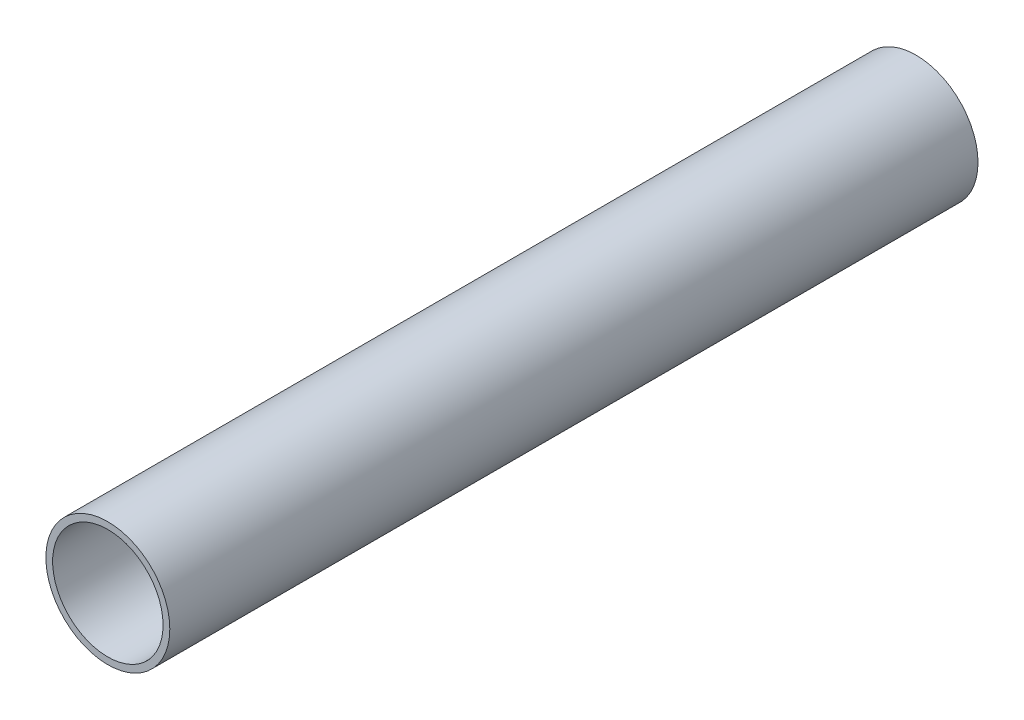
ISO-10303-21;
HEADER;
FILE_DESCRIPTION(('STEP AP214'),'2;1');
FILE_NAME('part.step','',(''),(''),'','','');
FILE_SCHEMA(('AUTOMOTIVE_DESIGN { 1 0 10303 214 1 1 1 1 }'));
ENDSEC;
DATA;
#1=APPLICATION_CONTEXT('core data for automotive mechanical design processes');
#2=APPLICATION_PROTOCOL_DEFINITION('international standard','automotive_design',2000,#1);
#3=PRODUCT_CONTEXT('',#1,'mechanical');
#4=PRODUCT('Part','Part','',(#3));
#5=PRODUCT_RELATED_PRODUCT_CATEGORY('part','',(#4));
#6=PRODUCT_DEFINITION_FORMATION('','',#4);
#7=PRODUCT_DEFINITION_CONTEXT('part definition',#1,'design');
#8=PRODUCT_DEFINITION('design','',#6,#7);
#9=PRODUCT_DEFINITION_SHAPE('','',#8);
#10=(LENGTH_UNIT() NAMED_UNIT(*) SI_UNIT(.MILLI.,.METRE.));
#11=(NAMED_UNIT(*) PLANE_ANGLE_UNIT() SI_UNIT($,.RADIAN.));
#12=(NAMED_UNIT(*) SI_UNIT($,.STERADIAN.) SOLID_ANGLE_UNIT());
#13=UNCERTAINTY_MEASURE_WITH_UNIT(LENGTH_MEASURE(1.E-05),#10,'distance_accuracy_value','');
#14=(GEOMETRIC_REPRESENTATION_CONTEXT(3) GLOBAL_UNCERTAINTY_ASSIGNED_CONTEXT((#13)) GLOBAL_UNIT_ASSIGNED_CONTEXT((#10,
#11,#12)) REPRESENTATION_CONTEXT('',''));
#15=CARTESIAN_POINT('',(0.,0.,0.));
#16=DIRECTION('',(0.,0.,1.));
#17=DIRECTION('',(1.,0.,0.));
#18=AXIS2_PLACEMENT_3D('',#15,#16,#17);
#19=CARTESIAN_POINT('',(0.,0.,30.));
#20=DIRECTION('',(0.,0.,-1.));
#21=DIRECTION('',(-1.,0.,0.));
#22=AXIS2_PLACEMENT_3D('',#19,#20,#21);
#23=CYLINDRICAL_SURFACE('',#22,2.05);
#24=CARTESIAN_POINT('',(0.,0.,30.));
#25=DIRECTION('',(0.,0.,1.));
#26=DIRECTION('',(1.,0.,0.));
#27=AXIS2_PLACEMENT_3D('',#24,#25,#26);
#28=CIRCLE('',#27,2.05);
#29=CARTESIAN_POINT('',(2.05,0.,30.));
#30=VERTEX_POINT('',#29);
#31=EDGE_CURVE('E40',#30,#30,#28,.T.);
#32=ORIENTED_EDGE('',*,*,#31,.T.);
#33=EDGE_LOOP('',(#32));
#34=FACE_BOUND('',#33,.T.);
#35=CARTESIAN_POINT('',(0.,0.,0.));
#36=DIRECTION('',(0.,0.,1.));
#37=DIRECTION('',(1.,0.,0.));
#38=AXIS2_PLACEMENT_3D('',#35,#36,#37);
#39=CIRCLE('',#38,2.05);
#40=CARTESIAN_POINT('',(2.05,0.,0.));
#41=VERTEX_POINT('',#40);
#42=EDGE_CURVE('E46',#41,#41,#39,.T.);
#43=ORIENTED_EDGE('',*,*,#42,.F.);
#44=EDGE_LOOP('',(#43));
#45=FACE_BOUND('',#44,.T.);
#46=ADVANCED_FACE('F33',(#34,#45),#23,.F.);
#47=CARTESIAN_POINT('',(0.,0.,30.));
#48=DIRECTION('',(0.,0.,-1.));
#49=DIRECTION('',(-1.,0.,0.));
#50=AXIS2_PLACEMENT_3D('',#47,#48,#49);
#51=CYLINDRICAL_SURFACE('',#50,2.3);
#52=CARTESIAN_POINT('',(0.,0.,30.));
#53=DIRECTION('',(0.,0.,1.));
#54=DIRECTION('',(1.,0.,0.));
#55=AXIS2_PLACEMENT_3D('',#52,#53,#54);
#56=CIRCLE('',#55,2.3);
#57=CARTESIAN_POINT('',(2.3,0.,30.));
#58=VERTEX_POINT('',#57);
#59=EDGE_CURVE('E10',#58,#58,#56,.T.);
#60=ORIENTED_EDGE('',*,*,#59,.F.);
#61=EDGE_LOOP('',(#60));
#62=FACE_BOUND('',#61,.T.);
#63=CARTESIAN_POINT('',(0.,0.,0.));
#64=DIRECTION('',(0.,0.,1.));
#65=DIRECTION('',(1.,0.,0.));
#66=AXIS2_PLACEMENT_3D('',#63,#64,#65);
#67=CIRCLE('',#66,2.3);
#68=CARTESIAN_POINT('',(2.3,0.,0.));
#69=VERTEX_POINT('',#68);
#70=EDGE_CURVE('E36',#69,#69,#67,.T.);
#71=ORIENTED_EDGE('',*,*,#70,.T.);
#72=EDGE_LOOP('',(#71));
#73=FACE_BOUND('',#72,.T.);
#74=ADVANCED_FACE('F53',(#62,#73),#51,.T.);
#75=CARTESIAN_POINT('',(0.,0.,30.));
#76=DIRECTION('',(0.,0.,1.));
#77=DIRECTION('',(1.,0.,0.));
#78=AXIS2_PLACEMENT_3D('',#75,#76,#77);
#79=PLANE('',#78);
#80=ORIENTED_EDGE('',*,*,#31,.F.);
#81=EDGE_LOOP('',(#80));
#82=FACE_BOUND('',#81,.T.);
#83=ORIENTED_EDGE('',*,*,#59,.T.);
#84=EDGE_LOOP('',(#83));
#85=FACE_BOUND('',#84,.T.);
#86=ADVANCED_FACE('F57',(#82,#85),#79,.T.);
#87=CARTESIAN_POINT('',(0.,0.,0.));
#88=DIRECTION('',(0.,0.,1.));
#89=DIRECTION('',(1.,0.,0.));
#90=AXIS2_PLACEMENT_3D('',#87,#88,#89);
#91=PLANE('',#90);
#92=ORIENTED_EDGE('',*,*,#42,.T.);
#93=EDGE_LOOP('',(#92));
#94=FACE_BOUND('',#93,.T.);
#95=ORIENTED_EDGE('',*,*,#70,.F.);
#96=EDGE_LOOP('',(#95));
#97=FACE_BOUND('',#96,.T.);
#98=ADVANCED_FACE('F55',(#94,#97),#91,.F.);
#99=CLOSED_SHELL('',(#46,#74,#86,#98));
#100=MANIFOLD_SOLID_BREP('B2',#99);
#101=ADVANCED_BREP_SHAPE_REPRESENTATION('',(#18,#100),#14);
#102=SHAPE_DEFINITION_REPRESENTATION(#9,#101);
ENDSEC;
END-ISO-10303-21;
